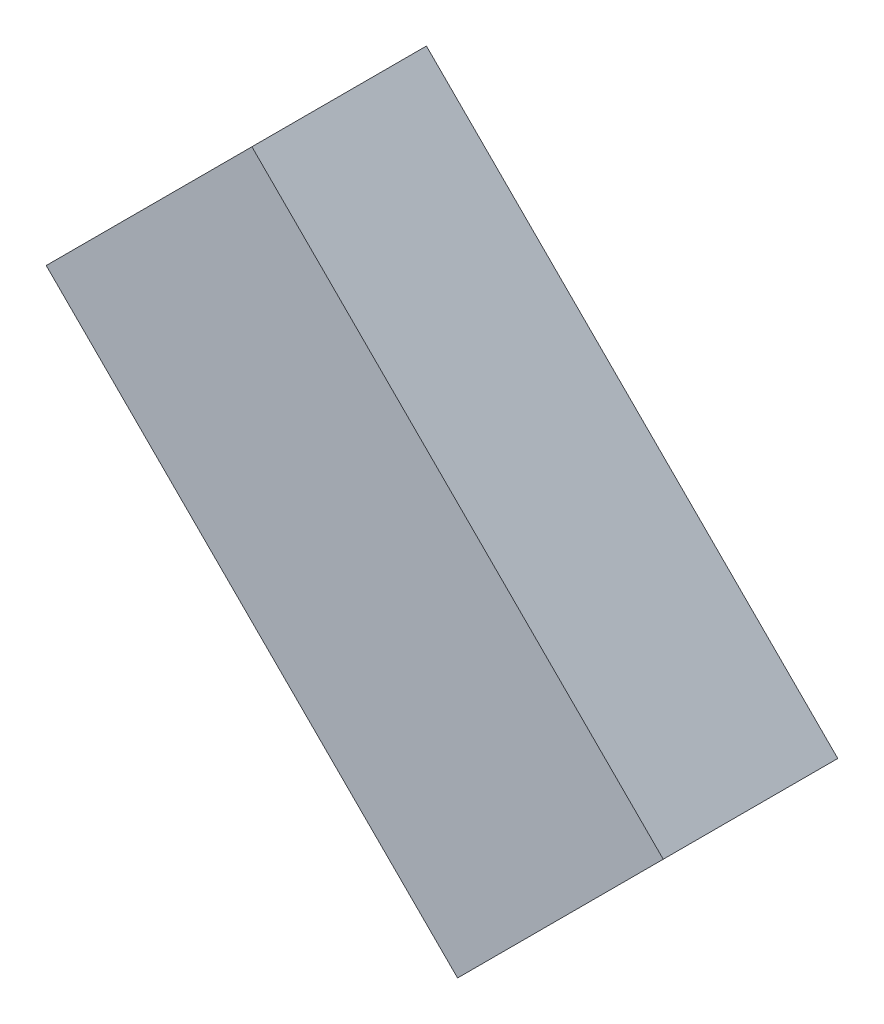
ISO-10303-21;
HEADER;
FILE_DESCRIPTION(('STEP AP214'),'2;1');
FILE_NAME('part.step','',(''),(''),'','','');
FILE_SCHEMA(('AUTOMOTIVE_DESIGN { 1 0 10303 214 1 1 1 1 }'));
ENDSEC;
DATA;
#1=APPLICATION_CONTEXT('core data for automotive mechanical design processes');
#2=APPLICATION_PROTOCOL_DEFINITION('international standard','automotive_design',2000,#1);
#3=PRODUCT_CONTEXT('',#1,'mechanical');
#4=PRODUCT('Part','Part','',(#3));
#5=PRODUCT_RELATED_PRODUCT_CATEGORY('part','',(#4));
#6=PRODUCT_DEFINITION_FORMATION('','',#4);
#7=PRODUCT_DEFINITION_CONTEXT('part definition',#1,'design');
#8=PRODUCT_DEFINITION('design','',#6,#7);
#9=PRODUCT_DEFINITION_SHAPE('','',#8);
#10=(LENGTH_UNIT() NAMED_UNIT(*) SI_UNIT(.MILLI.,.METRE.));
#11=(NAMED_UNIT(*) PLANE_ANGLE_UNIT() SI_UNIT($,.RADIAN.));
#12=(NAMED_UNIT(*) SI_UNIT($,.STERADIAN.) SOLID_ANGLE_UNIT());
#13=UNCERTAINTY_MEASURE_WITH_UNIT(LENGTH_MEASURE(1.E-05),#10,'distance_accuracy_value','');
#14=(GEOMETRIC_REPRESENTATION_CONTEXT(3) GLOBAL_UNCERTAINTY_ASSIGNED_CONTEXT((#13)) GLOBAL_UNIT_ASSIGNED_CONTEXT((#10,
#11,#12)) REPRESENTATION_CONTEXT('',''));
#15=CARTESIAN_POINT('',(0.,0.,0.));
#16=DIRECTION('',(0.,0.,1.));
#17=DIRECTION('',(1.,0.,0.));
#18=AXIS2_PLACEMENT_3D('',#15,#16,#17);
#19=CARTESIAN_POINT('',(-41.4834957055,-48.83883476483,120.));
#20=DIRECTION('',(0.,0.,1.));
#21=DIRECTION('',(1.,0.,0.));
#22=AXIS2_PLACEMENT_3D('',#19,#20,#21);
#23=PLANE('',#22);
#24=DIRECTION('',(-0.707106781186548,-0.707106781186548,0.));
#25=VECTOR('',#24,1.);
#26=CARTESIAN_POINT('',(-41.4834957055,-48.83883476483,120.));
#27=LINE('',#26,#25);
#28=CARTESIAN_POINT('',(-41.4834957055,-48.83883476483,120.));
#29=VERTEX_POINT('',#28);
#30=CARTESIAN_POINT('',(-59.16116523516,-66.51650429449,120.));
#31=VERTEX_POINT('',#30);
#32=EDGE_CURVE('E64',#29,#31,#27,.T.);
#33=ORIENTED_EDGE('',*,*,#32,.F.);
#34=DIRECTION('',(-0.707106781186548,0.707106781186548,0.));
#35=VECTOR('',#34,1.);
#36=CARTESIAN_POINT('',(-41.4834957055,-48.83883476483,120.));
#37=LINE('',#36,#35);
#38=CARTESIAN_POINT('',(-76.83883476483,-13.4834957055,120.));
#39=VERTEX_POINT('',#38);
#40=EDGE_CURVE('E93',#29,#39,#37,.T.);
#41=ORIENTED_EDGE('',*,*,#40,.T.);
#42=DIRECTION('',(-0.707106781186548,-0.707106781186548,0.));
#43=VECTOR('',#42,1.);
#44=CARTESIAN_POINT('',(-76.83883476483,-13.4834957055,120.));
#45=LINE('',#44,#43);
#46=CARTESIAN_POINT('',(-94.51650429449,-31.16116523516,120.));
#47=VERTEX_POINT('',#46);
#48=EDGE_CURVE('E66',#39,#47,#45,.T.);
#49=ORIENTED_EDGE('',*,*,#48,.T.);
#50=DIRECTION('',(-0.707106781186548,0.707106781186548,0.));
#51=VECTOR('',#50,1.);
#52=CARTESIAN_POINT('',(-59.16116523516,-66.51650429449,120.));
#53=LINE('',#52,#51);
#54=EDGE_CURVE('E10',#31,#47,#53,.T.);
#55=ORIENTED_EDGE('',*,*,#54,.F.);
#56=EDGE_LOOP('',(#33,#41,#49,#55));
#57=FACE_BOUND('',#56,.T.);
#58=ADVANCED_FACE('F15',(#57),#23,.T.);
#59=CARTESIAN_POINT('',(-41.4834957055,-48.83883476483,105.));
#60=DIRECTION('',(0.,0.,1.));
#61=DIRECTION('',(1.,0.,0.));
#62=AXIS2_PLACEMENT_3D('',#59,#60,#61);
#63=PLANE('',#62);
#64=DIRECTION('',(-0.707106781186548,0.707106781186548,0.));
#65=VECTOR('',#64,1.);
#66=CARTESIAN_POINT('',(-59.16116523516,-66.51650429449,105.));
#67=LINE('',#66,#65);
#68=CARTESIAN_POINT('',(-59.16116523516,-66.51650429449,105.));
#69=VERTEX_POINT('',#68);
#70=CARTESIAN_POINT('',(-94.51650429449,-31.16116523516,105.));
#71=VERTEX_POINT('',#70);
#72=EDGE_CURVE('E26',#69,#71,#67,.T.);
#73=ORIENTED_EDGE('',*,*,#72,.T.);
#74=DIRECTION('',(-0.707106781186548,-0.707106781186548,0.));
#75=VECTOR('',#74,1.);
#76=CARTESIAN_POINT('',(-76.83883476483,-13.4834957055,105.));
#77=LINE('',#76,#75);
#78=CARTESIAN_POINT('',(-76.83883476483,-13.4834957055,105.));
#79=VERTEX_POINT('',#78);
#80=EDGE_CURVE('E98',#79,#71,#77,.T.);
#81=ORIENTED_EDGE('',*,*,#80,.F.);
#82=DIRECTION('',(-0.707106781186548,0.707106781186548,0.));
#83=VECTOR('',#82,1.);
#84=CARTESIAN_POINT('',(-41.4834957055,-48.83883476483,105.));
#85=LINE('',#84,#83);
#86=CARTESIAN_POINT('',(-41.4834957055,-48.83883476483,105.));
#87=VERTEX_POINT('',#86);
#88=EDGE_CURVE('E90',#87,#79,#85,.T.);
#89=ORIENTED_EDGE('',*,*,#88,.F.);
#90=DIRECTION('',(-0.707106781186548,-0.707106781186548,0.));
#91=VECTOR('',#90,1.);
#92=CARTESIAN_POINT('',(-41.4834957055,-48.83883476483,105.));
#93=LINE('',#92,#91);
#94=EDGE_CURVE('E75',#87,#69,#93,.T.);
#95=ORIENTED_EDGE('',*,*,#94,.T.);
#96=EDGE_LOOP('',(#73,#81,#89,#95));
#97=FACE_BOUND('',#96,.T.);
#98=ADVANCED_FACE('F115',(#97),#63,.F.);
#99=CARTESIAN_POINT('',(-59.16116523516,-66.51650429449,105.));
#100=DIRECTION('',(-0.707106781186548,-0.707106781186548,0.));
#101=DIRECTION('',(-0.707106781186548,0.707106781186548,0.));
#102=AXIS2_PLACEMENT_3D('',#99,#100,#101);
#103=PLANE('',#102);
#104=ORIENTED_EDGE('',*,*,#72,.F.);
#105=DIRECTION('',(0.,0.,1.));
#106=VECTOR('',#105,1.);
#107=CARTESIAN_POINT('',(-59.16116523516,-66.51650429449,105.));
#108=LINE('',#107,#106);
#109=EDGE_CURVE('E69',#69,#31,#108,.T.);
#110=ORIENTED_EDGE('',*,*,#109,.T.);
#111=ORIENTED_EDGE('',*,*,#54,.T.);
#112=DIRECTION('',(0.,0.,1.));
#113=VECTOR('',#112,1.);
#114=CARTESIAN_POINT('',(-94.51650429449,-31.16116523516,105.));
#115=LINE('',#114,#113);
#116=EDGE_CURVE('E19',#71,#47,#115,.T.);
#117=ORIENTED_EDGE('',*,*,#116,.F.);
#118=EDGE_LOOP('',(#104,#110,#111,#117));
#119=FACE_BOUND('',#118,.T.);
#120=ADVANCED_FACE('F70',(#119),#103,.T.);
#121=CARTESIAN_POINT('',(-41.4834957055,-48.83883476483,105.));
#122=DIRECTION('',(-0.707106781186548,-0.707106781186548,0.));
#123=DIRECTION('',(-0.707106781186548,0.707106781186548,0.));
#124=AXIS2_PLACEMENT_3D('',#121,#122,#123);
#125=PLANE('',#124);
#126=DIRECTION('',(0.,0.,1.));
#127=VECTOR('',#126,1.);
#128=CARTESIAN_POINT('',(-76.83883476483,-13.4834957055,105.));
#129=LINE('',#128,#127);
#130=EDGE_CURVE('E94',#79,#39,#129,.T.);
#131=ORIENTED_EDGE('',*,*,#130,.T.);
#132=ORIENTED_EDGE('',*,*,#40,.F.);
#133=DIRECTION('',(0.,0.,1.));
#134=VECTOR('',#133,1.);
#135=CARTESIAN_POINT('',(-41.4834957055,-48.83883476483,105.));
#136=LINE('',#135,#134);
#137=EDGE_CURVE('E80',#87,#29,#136,.T.);
#138=ORIENTED_EDGE('',*,*,#137,.F.);
#139=ORIENTED_EDGE('',*,*,#88,.T.);
#140=EDGE_LOOP('',(#131,#132,#138,#139));
#141=FACE_BOUND('',#140,.T.);
#142=ADVANCED_FACE('F17',(#141),#125,.F.);
#143=CARTESIAN_POINT('',(-76.83883476483,-13.4834957055,105.));
#144=DIRECTION('',(-0.707106781186548,0.707106781186548,0.));
#145=DIRECTION('',(0.,0.,1.));
#146=AXIS2_PLACEMENT_3D('',#143,#144,#145);
#147=PLANE('',#146);
#148=ORIENTED_EDGE('',*,*,#130,.F.);
#149=ORIENTED_EDGE('',*,*,#80,.T.);
#150=ORIENTED_EDGE('',*,*,#116,.T.);
#151=ORIENTED_EDGE('',*,*,#48,.F.);
#152=EDGE_LOOP('',(#148,#149,#150,#151));
#153=FACE_BOUND('',#152,.T.);
#154=ADVANCED_FACE('F111',(#153),#147,.T.);
#155=CARTESIAN_POINT('',(-41.4834957055,-48.83883476483,105.));
#156=DIRECTION('',(-0.707106781186548,0.707106781186548,0.));
#157=DIRECTION('',(0.,0.,1.));
#158=AXIS2_PLACEMENT_3D('',#155,#156,#157);
#159=PLANE('',#158);
#160=ORIENTED_EDGE('',*,*,#32,.T.);
#161=ORIENTED_EDGE('',*,*,#109,.F.);
#162=ORIENTED_EDGE('',*,*,#94,.F.);
#163=ORIENTED_EDGE('',*,*,#137,.T.);
#164=EDGE_LOOP('',(#160,#161,#162,#163));
#165=FACE_BOUND('',#164,.T.);
#166=ADVANCED_FACE('F78',(#165),#159,.F.);
#167=CLOSED_SHELL('',(#58,#98,#120,#142,#154,#166));
#168=MANIFOLD_SOLID_BREP('B1',#167);
#169=ADVANCED_BREP_SHAPE_REPRESENTATION('',(#18,#168),#14);
#170=SHAPE_DEFINITION_REPRESENTATION(#9,#169);
ENDSEC;
END-ISO-10303-21;
